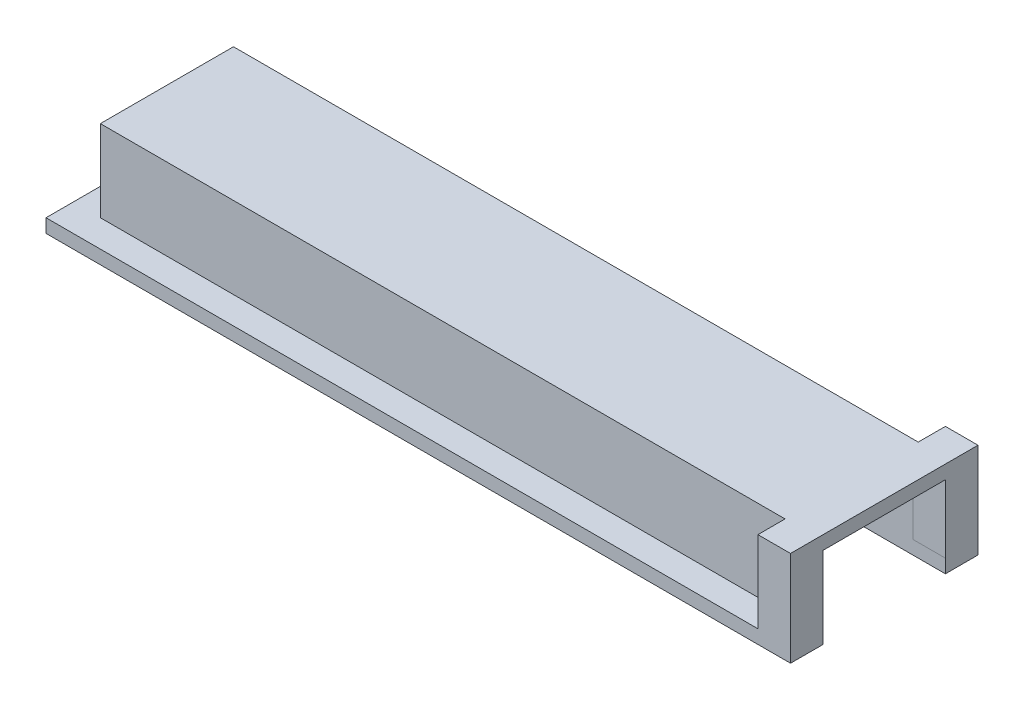
ISO-10303-21;
HEADER;
FILE_DESCRIPTION(('STEP AP214'),'2;1');
FILE_NAME('part.step','',(''),(''),'','','');
FILE_SCHEMA(('AUTOMOTIVE_DESIGN { 1 0 10303 214 1 1 1 1 }'));
ENDSEC;
DATA;
#1=APPLICATION_CONTEXT('core data for automotive mechanical design processes');
#2=APPLICATION_PROTOCOL_DEFINITION('international standard','automotive_design',2000,#1);
#3=PRODUCT_CONTEXT('',#1,'mechanical');
#4=PRODUCT('Part','Part','',(#3));
#5=PRODUCT_RELATED_PRODUCT_CATEGORY('part','',(#4));
#6=PRODUCT_DEFINITION_FORMATION('','',#4);
#7=PRODUCT_DEFINITION_CONTEXT('part definition',#1,'design');
#8=PRODUCT_DEFINITION('design','',#6,#7);
#9=PRODUCT_DEFINITION_SHAPE('','',#8);
#10=(LENGTH_UNIT() NAMED_UNIT(*) SI_UNIT(.MILLI.,.METRE.));
#11=(NAMED_UNIT(*) PLANE_ANGLE_UNIT() SI_UNIT($,.RADIAN.));
#12=(NAMED_UNIT(*) SI_UNIT($,.STERADIAN.) SOLID_ANGLE_UNIT());
#13=UNCERTAINTY_MEASURE_WITH_UNIT(LENGTH_MEASURE(1.E-05),#10,'distance_accuracy_value','');
#14=(GEOMETRIC_REPRESENTATION_CONTEXT(3) GLOBAL_UNCERTAINTY_ASSIGNED_CONTEXT((#13)) GLOBAL_UNIT_ASSIGNED_CONTEXT((#10,
#11,#12)) REPRESENTATION_CONTEXT('',''));
#15=CARTESIAN_POINT('',(0.,0.,0.));
#16=DIRECTION('',(0.,0.,1.));
#17=DIRECTION('',(1.,0.,0.));
#18=AXIS2_PLACEMENT_3D('',#15,#16,#17);
#19=CARTESIAN_POINT('',(0.,5.,-22.5));
#20=DIRECTION('',(0.,0.,-1.));
#21=DIRECTION('',(-1.,0.,0.));
#22=AXIS2_PLACEMENT_3D('',#19,#20,#21);
#23=PLANE('',#22);
#24=DIRECTION('',(0.,1.,0.));
#25=VECTOR('',#24,1.);
#26=CARTESIAN_POINT('',(125.,35.,-22.5));
#27=LINE('',#26,#25);
#28=CARTESIAN_POINT('',(125.,5.,-22.5));
#29=VERTEX_POINT('',#28);
#30=CARTESIAN_POINT('',(125.,30.,-22.5));
#31=VERTEX_POINT('',#30);
#32=EDGE_CURVE('E361',#29,#31,#27,.T.);
#33=ORIENTED_EDGE('',*,*,#32,.T.);
#34=DIRECTION('',(-1.,0.,0.));
#35=VECTOR('',#34,1.);
#36=CARTESIAN_POINT('',(137.,30.,-22.5));
#37=LINE('',#36,#35);
#38=CARTESIAN_POINT('',(-125.,30.,-22.5));
#39=VERTEX_POINT('',#38);
#40=EDGE_CURVE('E177',#31,#39,#37,.T.);
#41=ORIENTED_EDGE('',*,*,#40,.T.);
#42=DIRECTION('',(0.,-1.,0.));
#43=VECTOR('',#42,1.);
#44=CARTESIAN_POINT('',(-125.,5.,-22.5));
#45=LINE('',#44,#43);
#46=CARTESIAN_POINT('',(-125.,0.,-22.5));
#47=VERTEX_POINT('',#46);
#48=EDGE_CURVE('E169',#39,#47,#45,.T.);
#49=ORIENTED_EDGE('',*,*,#48,.T.);
#50=DIRECTION('',(1.,0.,0.));
#51=VECTOR('',#50,1.);
#52=CARTESIAN_POINT('',(0.,0.,-22.5));
#53=LINE('',#52,#51);
#54=CARTESIAN_POINT('',(137.,0.,-22.5));
#55=VERTEX_POINT('',#54);
#56=EDGE_CURVE('E174',#47,#55,#53,.T.);
#57=ORIENTED_EDGE('',*,*,#56,.T.);
#58=DIRECTION('',(0.,-1.,0.));
#59=VECTOR('',#58,1.);
#60=CARTESIAN_POINT('',(137.,5.,-22.5));
#61=LINE('',#60,#59);
#62=CARTESIAN_POINT('',(137.,5.,-22.5));
#63=VERTEX_POINT('',#62);
#64=EDGE_CURVE('E121',#63,#55,#61,.T.);
#65=ORIENTED_EDGE('',*,*,#64,.F.);
#66=DIRECTION('',(1.,0.,0.));
#67=VECTOR('',#66,1.);
#68=CARTESIAN_POINT('',(0.,5.,-22.5));
#69=LINE('',#68,#67);
#70=EDGE_CURVE('E192',#29,#63,#69,.T.);
#71=ORIENTED_EDGE('',*,*,#70,.F.);
#72=EDGE_LOOP('',(#33,#41,#49,#57,#65,#71));
#73=FACE_BOUND('',#72,.T.);
#74=ADVANCED_FACE('F113',(#73),#23,.F.);
#75=CARTESIAN_POINT('',(0.,5.,-34.5));
#76=DIRECTION('',(0.,0.,-1.));
#77=DIRECTION('',(-1.,0.,0.));
#78=AXIS2_PLACEMENT_3D('',#75,#76,#77);
#79=PLANE('',#78);
#80=DIRECTION('',(1.,0.,0.));
#81=VECTOR('',#80,1.);
#82=CARTESIAN_POINT('',(0.,0.,-34.5));
#83=LINE('',#82,#81);
#84=CARTESIAN_POINT('',(-137.,0.,-34.5));
#85=VERTEX_POINT('',#84);
#86=CARTESIAN_POINT('',(137.,0.,-34.5));
#87=VERTEX_POINT('',#86);
#88=EDGE_CURVE('E205',#85,#87,#83,.T.);
#89=ORIENTED_EDGE('',*,*,#88,.F.);
#90=DIRECTION('',(0.,-1.,0.));
#91=VECTOR('',#90,1.);
#92=CARTESIAN_POINT('',(-137.,5.,-34.5));
#93=LINE('',#92,#91);
#94=CARTESIAN_POINT('',(-137.,5.,-34.5));
#95=VERTEX_POINT('',#94);
#96=EDGE_CURVE('E235',#95,#85,#93,.T.);
#97=ORIENTED_EDGE('',*,*,#96,.F.);
#98=DIRECTION('',(1.,0.,0.));
#99=VECTOR('',#98,1.);
#100=CARTESIAN_POINT('',(0.,5.,-34.5));
#101=LINE('',#100,#99);
#102=CARTESIAN_POINT('',(125.,5.,-34.5));
#103=VERTEX_POINT('',#102);
#104=EDGE_CURVE('E370',#95,#103,#101,.T.);
#105=ORIENTED_EDGE('',*,*,#104,.T.);
#106=DIRECTION('',(0.,-1.,0.));
#107=VECTOR('',#106,1.);
#108=CARTESIAN_POINT('',(125.,35.,-34.5));
#109=LINE('',#108,#107);
#110=CARTESIAN_POINT('',(125.,35.,-34.5));
#111=VERTEX_POINT('',#110);
#112=EDGE_CURVE('E348',#111,#103,#109,.T.);
#113=ORIENTED_EDGE('',*,*,#112,.F.);
#114=DIRECTION('',(-1.,0.,0.));
#115=VECTOR('',#114,1.);
#116=CARTESIAN_POINT('',(137.,35.,-34.5));
#117=LINE('',#116,#115);
#118=CARTESIAN_POINT('',(137.,35.,-34.5));
#119=VERTEX_POINT('',#118);
#120=EDGE_CURVE('E429',#119,#111,#117,.T.);
#121=ORIENTED_EDGE('',*,*,#120,.F.);
#122=DIRECTION('',(0.,-1.,0.));
#123=VECTOR('',#122,1.);
#124=CARTESIAN_POINT('',(137.,5.,-34.5));
#125=LINE('',#124,#123);
#126=EDGE_CURVE('E238',#119,#87,#125,.T.);
#127=ORIENTED_EDGE('',*,*,#126,.T.);
#128=EDGE_LOOP('',(#89,#97,#105,#113,#121,#127));
#129=FACE_BOUND('',#128,.T.);
#130=ADVANCED_FACE('F494',(#129),#79,.T.);
#131=CARTESIAN_POINT('',(-137.,5.,0.));
#132=DIRECTION('',(-1.,0.,0.));
#133=DIRECTION('',(0.,0.,1.));
#134=AXIS2_PLACEMENT_3D('',#131,#132,#133);
#135=PLANE('',#134);
#136=DIRECTION('',(0.,0.,-1.));
#137=VECTOR('',#136,1.);
#138=CARTESIAN_POINT('',(-137.,0.,0.));
#139=LINE('',#138,#137);
#140=CARTESIAN_POINT('',(-137.,0.,34.5));
#141=VERTEX_POINT('',#140);
#142=EDGE_CURVE('E215',#141,#85,#139,.T.);
#143=ORIENTED_EDGE('',*,*,#142,.F.);
#144=DIRECTION('',(0.,-1.,0.));
#145=VECTOR('',#144,1.);
#146=CARTESIAN_POINT('',(-137.,5.,34.5));
#147=LINE('',#146,#145);
#148=CARTESIAN_POINT('',(-137.,5.,34.5));
#149=VERTEX_POINT('',#148);
#150=EDGE_CURVE('E137',#149,#141,#147,.T.);
#151=ORIENTED_EDGE('',*,*,#150,.F.);
#152=DIRECTION('',(0.,0.,-1.));
#153=VECTOR('',#152,1.);
#154=CARTESIAN_POINT('',(-137.,5.,0.));
#155=LINE('',#154,#153);
#156=EDGE_CURVE('E374',#149,#95,#155,.T.);
#157=ORIENTED_EDGE('',*,*,#156,.T.);
#158=ORIENTED_EDGE('',*,*,#96,.T.);
#159=EDGE_LOOP('',(#143,#151,#157,#158));
#160=FACE_BOUND('',#159,.T.);
#161=ADVANCED_FACE('F490',(#160),#135,.T.);
#162=CARTESIAN_POINT('',(0.,5.,34.5));
#163=DIRECTION('',(0.,0.,-1.));
#164=DIRECTION('',(-1.,0.,0.));
#165=AXIS2_PLACEMENT_3D('',#162,#163,#164);
#166=PLANE('',#165);
#167=DIRECTION('',(1.,0.,0.));
#168=VECTOR('',#167,1.);
#169=CARTESIAN_POINT('',(0.,0.,34.5));
#170=LINE('',#169,#168);
#171=CARTESIAN_POINT('',(137.,0.,34.5));
#172=VERTEX_POINT('',#171);
#173=EDGE_CURVE('E219',#141,#172,#170,.T.);
#174=ORIENTED_EDGE('',*,*,#173,.T.);
#175=DIRECTION('',(0.,-1.,0.));
#176=VECTOR('',#175,1.);
#177=CARTESIAN_POINT('',(137.,5.,34.5));
#178=LINE('',#177,#176);
#179=CARTESIAN_POINT('',(137.,35.,34.5));
#180=VERTEX_POINT('',#179);
#181=EDGE_CURVE('E229',#180,#172,#178,.T.);
#182=ORIENTED_EDGE('',*,*,#181,.F.);
#183=DIRECTION('',(1.,0.,0.));
#184=VECTOR('',#183,1.);
#185=CARTESIAN_POINT('',(125.,35.,34.5));
#186=LINE('',#185,#184);
#187=CARTESIAN_POINT('',(125.,35.,34.5));
#188=VERTEX_POINT('',#187);
#189=EDGE_CURVE('E407',#188,#180,#186,.T.);
#190=ORIENTED_EDGE('',*,*,#189,.F.);
#191=DIRECTION('',(0.,-1.,0.));
#192=VECTOR('',#191,1.);
#193=CARTESIAN_POINT('',(125.,35.,34.5));
#194=LINE('',#193,#192);
#195=CARTESIAN_POINT('',(125.,5.,34.5));
#196=VERTEX_POINT('',#195);
#197=EDGE_CURVE('E420',#188,#196,#194,.T.);
#198=ORIENTED_EDGE('',*,*,#197,.T.);
#199=DIRECTION('',(1.,0.,0.));
#200=VECTOR('',#199,1.);
#201=CARTESIAN_POINT('',(0.,5.,34.5));
#202=LINE('',#201,#200);
#203=EDGE_CURVE('E376',#149,#196,#202,.T.);
#204=ORIENTED_EDGE('',*,*,#203,.F.);
#205=ORIENTED_EDGE('',*,*,#150,.T.);
#206=EDGE_LOOP('',(#174,#182,#190,#198,#204,#205));
#207=FACE_BOUND('',#206,.T.);
#208=ADVANCED_FACE('F489',(#207),#166,.F.);
#209=CARTESIAN_POINT('',(137.,5.,0.));
#210=DIRECTION('',(-1.,0.,0.));
#211=DIRECTION('',(0.,0.,1.));
#212=AXIS2_PLACEMENT_3D('',#209,#210,#211);
#213=PLANE('',#212);
#214=DIRECTION('',(0.,0.,-1.));
#215=VECTOR('',#214,1.);
#216=CARTESIAN_POINT('',(137.,0.,0.));
#217=LINE('',#216,#215);
#218=CARTESIAN_POINT('',(137.,0.,22.5));
#219=VERTEX_POINT('',#218);
#220=EDGE_CURVE('E207',#172,#219,#217,.T.);
#221=ORIENTED_EDGE('',*,*,#220,.T.);
#222=DIRECTION('',(0.,-1.,0.));
#223=VECTOR('',#222,1.);
#224=CARTESIAN_POINT('',(137.,5.,22.5));
#225=LINE('',#224,#223);
#226=CARTESIAN_POINT('',(137.,5.,22.5));
#227=VERTEX_POINT('',#226);
#228=EDGE_CURVE('E226',#227,#219,#225,.T.);
#229=ORIENTED_EDGE('',*,*,#228,.F.);
#230=DIRECTION('',(0.,-1.,0.));
#231=VECTOR('',#230,1.);
#232=CARTESIAN_POINT('',(137.,35.,22.5));
#233=LINE('',#232,#231);
#234=CARTESIAN_POINT('',(137.,30.,22.5));
#235=VERTEX_POINT('',#234);
#236=EDGE_CURVE('E339',#235,#227,#233,.T.);
#237=ORIENTED_EDGE('',*,*,#236,.F.);
#238=DIRECTION('',(0.,0.,-1.));
#239=VECTOR('',#238,1.);
#240=CARTESIAN_POINT('',(137.,30.,-22.5));
#241=LINE('',#240,#239);
#242=CARTESIAN_POINT('',(137.,30.,-22.5));
#243=VERTEX_POINT('',#242);
#244=EDGE_CURVE('E328',#235,#243,#241,.T.);
#245=ORIENTED_EDGE('',*,*,#244,.T.);
#246=DIRECTION('',(0.,-1.,0.));
#247=VECTOR('',#246,1.);
#248=CARTESIAN_POINT('',(137.,35.,-22.5));
#249=LINE('',#248,#247);
#250=EDGE_CURVE('E249',#243,#63,#249,.T.);
#251=ORIENTED_EDGE('',*,*,#250,.T.);
#252=ORIENTED_EDGE('',*,*,#64,.T.);
#253=EDGE_CURVE('E198',#55,#87,#217,.T.);
#254=ORIENTED_EDGE('',*,*,#253,.T.);
#255=ORIENTED_EDGE('',*,*,#126,.F.);
#256=DIRECTION('',(0.,0.,-1.));
#257=VECTOR('',#256,1.);
#258=CARTESIAN_POINT('',(137.,35.,-22.5));
#259=LINE('',#258,#257);
#260=EDGE_CURVE('E354',#180,#119,#259,.T.);
#261=ORIENTED_EDGE('',*,*,#260,.F.);
#262=ORIENTED_EDGE('',*,*,#181,.T.);
#263=EDGE_LOOP('',(#221,#229,#237,#245,#251,#252,#254,#255,#261,#262));
#264=FACE_BOUND('',#263,.T.);
#265=ADVANCED_FACE('F244',(#264),#213,.F.);
#266=CARTESIAN_POINT('',(0.,5.,22.5));
#267=DIRECTION('',(0.,0.,-1.));
#268=DIRECTION('',(-1.,0.,0.));
#269=AXIS2_PLACEMENT_3D('',#266,#267,#268);
#270=PLANE('',#269);
#271=DIRECTION('',(1.,0.,0.));
#272=VECTOR('',#271,1.);
#273=CARTESIAN_POINT('',(137.,30.,22.5));
#274=LINE('',#273,#272);
#275=CARTESIAN_POINT('',(-125.,30.,22.5));
#276=VERTEX_POINT('',#275);
#277=CARTESIAN_POINT('',(125.,30.,22.5));
#278=VERTEX_POINT('',#277);
#279=EDGE_CURVE('E396',#276,#278,#274,.T.);
#280=ORIENTED_EDGE('',*,*,#279,.T.);
#281=DIRECTION('',(0.,1.,0.));
#282=VECTOR('',#281,1.);
#283=CARTESIAN_POINT('',(125.,35.,22.5));
#284=LINE('',#283,#282);
#285=CARTESIAN_POINT('',(125.,5.,22.5));
#286=VERTEX_POINT('',#285);
#287=EDGE_CURVE('E208',#286,#278,#284,.T.);
#288=ORIENTED_EDGE('',*,*,#287,.F.);
#289=DIRECTION('',(1.,0.,0.));
#290=VECTOR('',#289,1.);
#291=CARTESIAN_POINT('',(0.,5.,22.5));
#292=LINE('',#291,#290);
#293=EDGE_CURVE('E182',#286,#227,#292,.T.);
#294=ORIENTED_EDGE('',*,*,#293,.T.);
#295=ORIENTED_EDGE('',*,*,#228,.T.);
#296=DIRECTION('',(1.,0.,0.));
#297=VECTOR('',#296,1.);
#298=CARTESIAN_POINT('',(0.,0.,22.5));
#299=LINE('',#298,#297);
#300=CARTESIAN_POINT('',(-125.,0.,22.5));
#301=VERTEX_POINT('',#300);
#302=EDGE_CURVE('E193',#301,#219,#299,.T.);
#303=ORIENTED_EDGE('',*,*,#302,.F.);
#304=DIRECTION('',(0.,-1.,0.));
#305=VECTOR('',#304,1.);
#306=CARTESIAN_POINT('',(-125.,5.,22.5));
#307=LINE('',#306,#305);
#308=EDGE_CURVE('E181',#276,#301,#307,.T.);
#309=ORIENTED_EDGE('',*,*,#308,.F.);
#310=EDGE_LOOP('',(#280,#288,#294,#295,#303,#309));
#311=FACE_BOUND('',#310,.T.);
#312=ADVANCED_FACE('F387',(#311),#270,.T.);
#313=CARTESIAN_POINT('',(-125.,5.,0.));
#314=DIRECTION('',(-1.,0.,0.));
#315=DIRECTION('',(0.,0.,1.));
#316=AXIS2_PLACEMENT_3D('',#313,#314,#315);
#317=PLANE('',#316);
#318=ORIENTED_EDGE('',*,*,#48,.F.);
#319=DIRECTION('',(0.,0.,1.));
#320=VECTOR('',#319,1.);
#321=CARTESIAN_POINT('',(-125.,30.,-22.5));
#322=LINE('',#321,#320);
#323=EDGE_CURVE('E398',#39,#276,#322,.T.);
#324=ORIENTED_EDGE('',*,*,#323,.T.);
#325=ORIENTED_EDGE('',*,*,#308,.T.);
#326=DIRECTION('',(0.,0.,-1.));
#327=VECTOR('',#326,1.);
#328=CARTESIAN_POINT('',(-125.,0.,0.));
#329=LINE('',#328,#327);
#330=EDGE_CURVE('E185',#301,#47,#329,.T.);
#331=ORIENTED_EDGE('',*,*,#330,.T.);
#332=EDGE_LOOP('',(#318,#324,#325,#331));
#333=FACE_BOUND('',#332,.T.);
#334=ADVANCED_FACE('F186',(#333),#317,.F.);
#335=CARTESIAN_POINT('',(0.,5.,0.));
#336=DIRECTION('',(0.,1.,0.));
#337=DIRECTION('',(0.,0.,1.));
#338=AXIS2_PLACEMENT_3D('',#335,#336,#337);
#339=PLANE('',#338);
#340=DIRECTION('',(0.,0.,-1.));
#341=VECTOR('',#340,1.);
#342=CARTESIAN_POINT('',(125.,5.,-22.4993567016586));
#343=LINE('',#342,#341);
#344=CARTESIAN_POINT('',(125.,5.,-24.4993567016587));
#345=VERTEX_POINT('',#344);
#346=EDGE_CURVE('E439',#345,#103,#343,.T.);
#347=ORIENTED_EDGE('',*,*,#346,.T.);
#348=ORIENTED_EDGE('',*,*,#104,.F.);
#349=ORIENTED_EDGE('',*,*,#156,.F.);
#350=ORIENTED_EDGE('',*,*,#203,.T.);
#351=DIRECTION('',(0.,0.,1.));
#352=VECTOR('',#351,1.);
#353=CARTESIAN_POINT('',(125.,5.,22.4993567016586));
#354=LINE('',#353,#352);
#355=CARTESIAN_POINT('',(125.,5.,24.4993567016586));
#356=VERTEX_POINT('',#355);
#357=EDGE_CURVE('E408',#356,#196,#354,.T.);
#358=ORIENTED_EDGE('',*,*,#357,.F.);
#359=DIRECTION('',(1.,0.,0.));
#360=VECTOR('',#359,1.);
#361=CARTESIAN_POINT('',(0.,5.,24.4993567016586));
#362=LINE('',#361,#360);
#363=CARTESIAN_POINT('',(-127.,5.,24.4993567016586));
#364=VERTEX_POINT('',#363);
#365=EDGE_CURVE('E128',#364,#356,#362,.T.);
#366=ORIENTED_EDGE('',*,*,#365,.F.);
#367=DIRECTION('',(0.,0.,-1.));
#368=VECTOR('',#367,1.);
#369=CARTESIAN_POINT('',(-127.,5.,0.));
#370=LINE('',#369,#368);
#371=CARTESIAN_POINT('',(-127.,5.,-24.4993567016587));
#372=VERTEX_POINT('',#371);
#373=EDGE_CURVE('E457',#364,#372,#370,.T.);
#374=ORIENTED_EDGE('',*,*,#373,.T.);
#375=DIRECTION('',(1.,0.,0.));
#376=VECTOR('',#375,1.);
#377=CARTESIAN_POINT('',(0.,5.,-24.4993567016587));
#378=LINE('',#377,#376);
#379=EDGE_CURVE('E468',#372,#345,#378,.T.);
#380=ORIENTED_EDGE('',*,*,#379,.T.);
#381=EDGE_LOOP('',(#347,#348,#349,#350,#358,#366,#374,#380));
#382=FACE_BOUND('',#381,.T.);
#383=ADVANCED_FACE('F502',(#382),#339,.T.);
#384=CARTESIAN_POINT('',(0.,0.,0.));
#385=DIRECTION('',(0.,1.,0.));
#386=DIRECTION('',(0.,0.,1.));
#387=AXIS2_PLACEMENT_3D('',#384,#385,#386);
#388=PLANE('',#387);
#389=ORIENTED_EDGE('',*,*,#56,.F.);
#390=ORIENTED_EDGE('',*,*,#330,.F.);
#391=ORIENTED_EDGE('',*,*,#302,.T.);
#392=ORIENTED_EDGE('',*,*,#220,.F.);
#393=ORIENTED_EDGE('',*,*,#173,.F.);
#394=ORIENTED_EDGE('',*,*,#142,.T.);
#395=ORIENTED_EDGE('',*,*,#88,.T.);
#396=ORIENTED_EDGE('',*,*,#253,.F.);
#397=EDGE_LOOP('',(#389,#390,#391,#392,#393,#394,#395,#396));
#398=FACE_BOUND('',#397,.T.);
#399=ADVANCED_FACE('F195',(#398),#388,.F.);
#400=CARTESIAN_POINT('',(0.,5.,0.));
#401=DIRECTION('',(0.,1.,0.));
#402=DIRECTION('',(0.,0.,1.));
#403=AXIS2_PLACEMENT_3D('',#400,#401,#402);
#404=PLANE('',#403);
#405=CARTESIAN_POINT('',(125.,5.,-22.4993567016586));
#406=VERTEX_POINT('',#405);
#407=EDGE_CURVE('E436',#406,#29,#343,.T.);
#408=ORIENTED_EDGE('',*,*,#407,.T.);
#409=ORIENTED_EDGE('',*,*,#70,.T.);
#410=DIRECTION('',(0.999999998563081,0.,-5.36081950354451E-05));
#411=VECTOR('',#410,1.);
#412=CARTESIAN_POINT('',(125.,5.,-22.4993567016586));
#413=LINE('',#412,#411);
#414=EDGE_CURVE('E345',#406,#63,#413,.T.);
#415=ORIENTED_EDGE('',*,*,#414,.F.);
#416=EDGE_LOOP('',(#408,#409,#415));
#417=FACE_BOUND('',#416,.T.);
#418=ADVANCED_FACE('F541',(#417),#404,.F.);
#419=ORIENTED_EDGE('',*,*,#293,.F.);
#420=CARTESIAN_POINT('',(125.,5.,22.4993567016586));
#421=VERTEX_POINT('',#420);
#422=EDGE_CURVE('E403',#421,#286,#354,.T.);
#423=ORIENTED_EDGE('',*,*,#422,.F.);
#424=DIRECTION('',(0.999999998563081,0.,5.36081950351559E-05));
#425=VECTOR('',#424,1.);
#426=CARTESIAN_POINT('',(125.,5.,22.4993567016586));
#427=LINE('',#426,#425);
#428=EDGE_CURVE('E352',#421,#227,#427,.T.);
#429=ORIENTED_EDGE('',*,*,#428,.T.);
#430=EDGE_LOOP('',(#419,#423,#429));
#431=FACE_BOUND('',#430,.T.);
#432=ADVANCED_FACE('F585',(#431),#404,.F.);
#433=CARTESIAN_POINT('',(0.,35.,0.));
#434=DIRECTION('',(0.,1.,0.));
#435=DIRECTION('',(0.,0.,1.));
#436=AXIS2_PLACEMENT_3D('',#433,#434,#435);
#437=PLANE('',#436);
#438=ORIENTED_EDGE('',*,*,#189,.T.);
#439=ORIENTED_EDGE('',*,*,#260,.T.);
#440=ORIENTED_EDGE('',*,*,#120,.T.);
#441=DIRECTION('',(0.,0.,-1.));
#442=VECTOR('',#441,1.);
#443=CARTESIAN_POINT('',(125.,35.,-22.4993567016586));
#444=LINE('',#443,#442);
#445=CARTESIAN_POINT('',(125.,35.,-24.4993567016587));
#446=VERTEX_POINT('',#445);
#447=EDGE_CURVE('E426',#446,#111,#444,.T.);
#448=ORIENTED_EDGE('',*,*,#447,.F.);
#449=DIRECTION('',(1.,0.,0.));
#450=VECTOR('',#449,1.);
#451=CARTESIAN_POINT('',(0.,35.,-24.4993567016587));
#452=LINE('',#451,#450);
#453=CARTESIAN_POINT('',(-127.,35.,-24.4993567016587));
#454=VERTEX_POINT('',#453);
#455=EDGE_CURVE('E456',#454,#446,#452,.T.);
#456=ORIENTED_EDGE('',*,*,#455,.F.);
#457=DIRECTION('',(0.,0.,-1.));
#458=VECTOR('',#457,1.);
#459=CARTESIAN_POINT('',(-127.,35.,0.));
#460=LINE('',#459,#458);
#461=CARTESIAN_POINT('',(-127.,35.,24.4993567016586));
#462=VERTEX_POINT('',#461);
#463=EDGE_CURVE('E461',#462,#454,#460,.T.);
#464=ORIENTED_EDGE('',*,*,#463,.F.);
#465=DIRECTION('',(1.,0.,0.));
#466=VECTOR('',#465,1.);
#467=CARTESIAN_POINT('',(0.,35.,24.4993567016586));
#468=LINE('',#467,#466);
#469=CARTESIAN_POINT('',(125.,35.,24.4993567016586));
#470=VERTEX_POINT('',#469);
#471=EDGE_CURVE('E452',#462,#470,#468,.T.);
#472=ORIENTED_EDGE('',*,*,#471,.T.);
#473=DIRECTION('',(0.,0.,1.));
#474=VECTOR('',#473,1.);
#475=CARTESIAN_POINT('',(125.,35.,22.4993567016586));
#476=LINE('',#475,#474);
#477=EDGE_CURVE('E413',#470,#188,#476,.T.);
#478=ORIENTED_EDGE('',*,*,#477,.T.);
#479=EDGE_LOOP('',(#438,#439,#440,#448,#456,#464,#472,#478));
#480=FACE_BOUND('',#479,.T.);
#481=ADVANCED_FACE('F482',(#480),#437,.T.);
#482=CARTESIAN_POINT('',(0.,35.,-24.4993567016587));
#483=DIRECTION('',(0.,0.,-1.));
#484=DIRECTION('',(-1.,0.,0.));
#485=AXIS2_PLACEMENT_3D('',#482,#483,#484);
#486=PLANE('',#485);
#487=DIRECTION('',(0.,1.,0.));
#488=VECTOR('',#487,1.);
#489=CARTESIAN_POINT('',(125.,35.,-24.4993567016587));
#490=LINE('',#489,#488);
#491=EDGE_CURVE('E358',#345,#446,#490,.T.);
#492=ORIENTED_EDGE('',*,*,#491,.F.);
#493=ORIENTED_EDGE('',*,*,#379,.F.);
#494=DIRECTION('',(0.,-1.,0.));
#495=VECTOR('',#494,1.);
#496=CARTESIAN_POINT('',(-127.,35.,-24.4993567016587));
#497=LINE('',#496,#495);
#498=EDGE_CURVE('E362',#454,#372,#497,.T.);
#499=ORIENTED_EDGE('',*,*,#498,.F.);
#500=ORIENTED_EDGE('',*,*,#455,.T.);
#501=EDGE_LOOP('',(#492,#493,#499,#500));
#502=FACE_BOUND('',#501,.T.);
#503=ADVANCED_FACE('F506',(#502),#486,.T.);
#504=CARTESIAN_POINT('',(-127.,35.,0.));
#505=DIRECTION('',(-1.,0.,0.));
#506=DIRECTION('',(0.,0.,1.));
#507=AXIS2_PLACEMENT_3D('',#504,#505,#506);
#508=PLANE('',#507);
#509=ORIENTED_EDGE('',*,*,#373,.F.);
#510=DIRECTION('',(0.,-1.,0.));
#511=VECTOR('',#510,1.);
#512=CARTESIAN_POINT('',(-127.,35.,24.4993567016586));
#513=LINE('',#512,#511);
#514=EDGE_CURVE('E465',#462,#364,#513,.T.);
#515=ORIENTED_EDGE('',*,*,#514,.F.);
#516=ORIENTED_EDGE('',*,*,#463,.T.);
#517=ORIENTED_EDGE('',*,*,#498,.T.);
#518=EDGE_LOOP('',(#509,#515,#516,#517));
#519=FACE_BOUND('',#518,.T.);
#520=ADVANCED_FACE('F508',(#519),#508,.T.);
#521=CARTESIAN_POINT('',(0.,35.,24.4993567016586));
#522=DIRECTION('',(0.,0.,-1.));
#523=DIRECTION('',(-1.,0.,0.));
#524=AXIS2_PLACEMENT_3D('',#521,#522,#523);
#525=PLANE('',#524);
#526=DIRECTION('',(0.,-1.,0.));
#527=VECTOR('',#526,1.);
#528=CARTESIAN_POINT('',(125.,35.,24.4993567016586));
#529=LINE('',#528,#527);
#530=EDGE_CURVE('E201',#470,#356,#529,.T.);
#531=ORIENTED_EDGE('',*,*,#530,.F.);
#532=ORIENTED_EDGE('',*,*,#471,.F.);
#533=ORIENTED_EDGE('',*,*,#514,.T.);
#534=ORIENTED_EDGE('',*,*,#365,.T.);
#535=EDGE_LOOP('',(#531,#532,#533,#534));
#536=FACE_BOUND('',#535,.T.);
#537=ADVANCED_FACE('F509',(#536),#525,.F.);
#538=CARTESIAN_POINT('',(125.,35.,-22.4993567016586));
#539=DIRECTION('',(-1.,0.,0.));
#540=DIRECTION('',(0.,0.,1.));
#541=AXIS2_PLACEMENT_3D('',#538,#539,#540);
#542=PLANE('',#541);
#543=DIRECTION('',(0.,0.,1.));
#544=VECTOR('',#543,1.);
#545=CARTESIAN_POINT('',(125.,30.,-22.4993567016586));
#546=LINE('',#545,#544);
#547=CARTESIAN_POINT('',(125.,30.,-22.4993567016586));
#548=VERTEX_POINT('',#547);
#549=EDGE_CURVE('E331',#31,#548,#546,.T.);
#550=ORIENTED_EDGE('',*,*,#549,.F.);
#551=ORIENTED_EDGE('',*,*,#32,.F.);
#552=ORIENTED_EDGE('',*,*,#407,.F.);
#553=DIRECTION('',(0.,-1.,0.));
#554=VECTOR('',#553,1.);
#555=CARTESIAN_POINT('',(125.,35.,-22.4993567016586));
#556=LINE('',#555,#554);
#557=EDGE_CURVE('E347',#548,#406,#556,.T.);
#558=ORIENTED_EDGE('',*,*,#557,.F.);
#559=EDGE_LOOP('',(#550,#551,#552,#558));
#560=FACE_BOUND('',#559,.T.);
#561=ADVANCED_FACE('F511',(#560),#542,.T.);
#562=CARTESIAN_POINT('',(125.,35.,-22.4993567016586));
#563=DIRECTION('',(-5.36081950354451E-05,0.,-0.999999998563081));
#564=DIRECTION('',(-0.999999998563081,0.,5.36081950354451E-05));
#565=AXIS2_PLACEMENT_3D('',#562,#563,#564);
#566=PLANE('',#565);
#567=ORIENTED_EDGE('',*,*,#250,.F.);
#568=DIRECTION('',(-0.999999998563081,0.,5.36081950354451E-05));
#569=VECTOR('',#568,1.);
#570=CARTESIAN_POINT('',(125.,30.,-22.4993567016586));
#571=LINE('',#570,#569);
#572=EDGE_CURVE('E326',#243,#548,#571,.T.);
#573=ORIENTED_EDGE('',*,*,#572,.T.);
#574=ORIENTED_EDGE('',*,*,#557,.T.);
#575=ORIENTED_EDGE('',*,*,#414,.T.);
#576=EDGE_LOOP('',(#567,#573,#574,#575));
#577=FACE_BOUND('',#576,.T.);
#578=ADVANCED_FACE('F343',(#577),#566,.F.);
#579=ORIENTED_EDGE('',*,*,#346,.F.);
#580=ORIENTED_EDGE('',*,*,#491,.T.);
#581=ORIENTED_EDGE('',*,*,#447,.T.);
#582=ORIENTED_EDGE('',*,*,#112,.T.);
#583=EDGE_LOOP('',(#579,#580,#581,#582));
#584=FACE_BOUND('',#583,.T.);
#585=ADVANCED_FACE('F501',(#584),#542,.T.);
#586=CARTESIAN_POINT('',(125.,35.,22.4993567016586));
#587=DIRECTION('',(5.36081950351559E-05,0.,-0.999999998563081));
#588=DIRECTION('',(-0.999999998563081,0.,-5.36081950351559E-05));
#589=AXIS2_PLACEMENT_3D('',#586,#587,#588);
#590=PLANE('',#589);
#591=DIRECTION('',(-0.999999998563081,0.,-5.36081950351559E-05));
#592=VECTOR('',#591,1.);
#593=CARTESIAN_POINT('',(125.,30.,22.4993567016586));
#594=LINE('',#593,#592);
#595=CARTESIAN_POINT('',(125.,30.,22.4993567016586));
#596=VERTEX_POINT('',#595);
#597=EDGE_CURVE('E335',#235,#596,#594,.T.);
#598=ORIENTED_EDGE('',*,*,#597,.F.);
#599=ORIENTED_EDGE('',*,*,#236,.T.);
#600=ORIENTED_EDGE('',*,*,#428,.F.);
#601=DIRECTION('',(0.,-1.,0.));
#602=VECTOR('',#601,1.);
#603=CARTESIAN_POINT('',(125.,35.,22.4993567016586));
#604=LINE('',#603,#602);
#605=EDGE_CURVE('E404',#596,#421,#604,.T.);
#606=ORIENTED_EDGE('',*,*,#605,.F.);
#607=EDGE_LOOP('',(#598,#599,#600,#606));
#608=FACE_BOUND('',#607,.T.);
#609=ADVANCED_FACE('F545',(#608),#590,.T.);
#610=CARTESIAN_POINT('',(125.,35.,22.4993567016586));
#611=DIRECTION('',(1.,0.,0.));
#612=DIRECTION('',(0.,0.,-1.));
#613=AXIS2_PLACEMENT_3D('',#610,#611,#612);
#614=PLANE('',#613);
#615=ORIENTED_EDGE('',*,*,#287,.T.);
#616=DIRECTION('',(0.,0.,-1.));
#617=VECTOR('',#616,1.);
#618=CARTESIAN_POINT('',(125.,30.,22.4993567016586));
#619=LINE('',#618,#617);
#620=EDGE_CURVE('E12',#278,#596,#619,.T.);
#621=ORIENTED_EDGE('',*,*,#620,.T.);
#622=ORIENTED_EDGE('',*,*,#605,.T.);
#623=ORIENTED_EDGE('',*,*,#422,.T.);
#624=EDGE_LOOP('',(#615,#621,#622,#623));
#625=FACE_BOUND('',#624,.T.);
#626=ADVANCED_FACE('F401',(#625),#614,.F.);
#627=ORIENTED_EDGE('',*,*,#477,.F.);
#628=ORIENTED_EDGE('',*,*,#530,.T.);
#629=ORIENTED_EDGE('',*,*,#357,.T.);
#630=ORIENTED_EDGE('',*,*,#197,.F.);
#631=EDGE_LOOP('',(#627,#628,#629,#630));
#632=FACE_BOUND('',#631,.T.);
#633=ADVANCED_FACE('F487',(#632),#614,.F.);
#634=CARTESIAN_POINT('',(0.,30.,0.));
#635=DIRECTION('',(0.,-1.,0.));
#636=DIRECTION('',(0.,0.,-1.));
#637=AXIS2_PLACEMENT_3D('',#634,#635,#636);
#638=PLANE('',#637);
#639=ORIENTED_EDGE('',*,*,#40,.F.);
#640=ORIENTED_EDGE('',*,*,#549,.T.);
#641=ORIENTED_EDGE('',*,*,#572,.F.);
#642=ORIENTED_EDGE('',*,*,#244,.F.);
#643=ORIENTED_EDGE('',*,*,#597,.T.);
#644=ORIENTED_EDGE('',*,*,#620,.F.);
#645=ORIENTED_EDGE('',*,*,#279,.F.);
#646=ORIENTED_EDGE('',*,*,#323,.F.);
#647=EDGE_LOOP('',(#639,#640,#641,#642,#643,#644,#645,#646));
#648=FACE_BOUND('',#647,.T.);
#649=ADVANCED_FACE('F327',(#648),#638,.T.);
#650=CLOSED_SHELL('',(#74,#130,#161,#208,#265,#312,#334,#383,#399,#418,#432,#481,#503,#520,#537,
#561,#578,#585,#609,#626,#633,#649));
#651=MANIFOLD_SOLID_BREP('B2',#650);
#652=ADVANCED_BREP_SHAPE_REPRESENTATION('',(#18,#651),#14);
#653=SHAPE_DEFINITION_REPRESENTATION(#9,#652);
ENDSEC;
END-ISO-10303-21;
